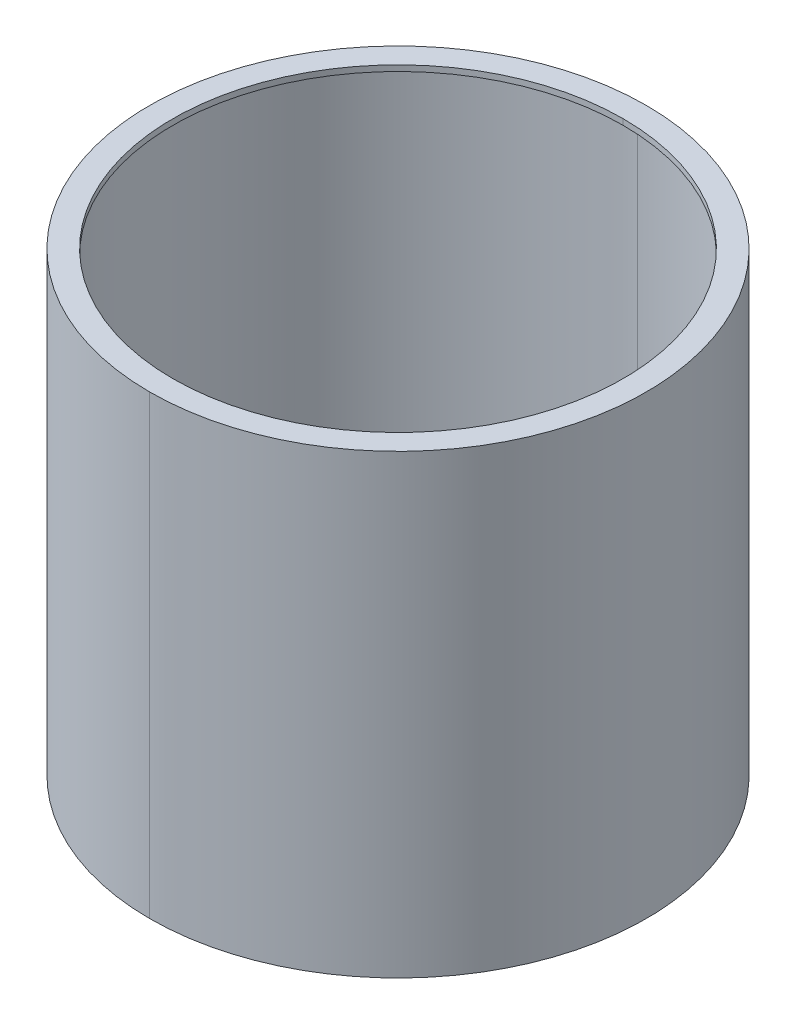
ISO-10303-21;
HEADER;
FILE_DESCRIPTION(('STEP AP214'),'2;1');
FILE_NAME('part.step','',(''),(''),'','','');
FILE_SCHEMA(('AUTOMOTIVE_DESIGN { 1 0 10303 214 1 1 1 1 }'));
ENDSEC;
DATA;
#1=APPLICATION_CONTEXT('core data for automotive mechanical design processes');
#2=APPLICATION_PROTOCOL_DEFINITION('international standard','automotive_design',2000,#1);
#3=PRODUCT_CONTEXT('',#1,'mechanical');
#4=PRODUCT('Part','Part','',(#3));
#5=PRODUCT_RELATED_PRODUCT_CATEGORY('part','',(#4));
#6=PRODUCT_DEFINITION_FORMATION('','',#4);
#7=PRODUCT_DEFINITION_CONTEXT('part definition',#1,'design');
#8=PRODUCT_DEFINITION('design','',#6,#7);
#9=PRODUCT_DEFINITION_SHAPE('','',#8);
#10=(LENGTH_UNIT() NAMED_UNIT(*) SI_UNIT(.MILLI.,.METRE.));
#11=(NAMED_UNIT(*) PLANE_ANGLE_UNIT() SI_UNIT($,.RADIAN.));
#12=(NAMED_UNIT(*) SI_UNIT($,.STERADIAN.) SOLID_ANGLE_UNIT());
#13=UNCERTAINTY_MEASURE_WITH_UNIT(LENGTH_MEASURE(1.E-05),#10,'distance_accuracy_value','');
#14=(GEOMETRIC_REPRESENTATION_CONTEXT(3) GLOBAL_UNCERTAINTY_ASSIGNED_CONTEXT((#13)) GLOBAL_UNIT_ASSIGNED_CONTEXT((#10,
#11,#12)) REPRESENTATION_CONTEXT('',''));
#15=CARTESIAN_POINT('',(0.,0.,0.));
#16=DIRECTION('',(0.,0.,1.));
#17=DIRECTION('',(1.,0.,0.));
#18=AXIS2_PLACEMENT_3D('',#15,#16,#17);
#19=CARTESIAN_POINT('',(0.,19.25,0.));
#20=DIRECTION('',(0.,-1.,0.));
#21=DIRECTION('',(0.,0.,-1.));
#22=AXIS2_PLACEMENT_3D('',#19,#20,#21);
#23=CYLINDRICAL_SURFACE('',#22,20.75);
#24=CARTESIAN_POINT('',(0.,19.25,0.));
#25=DIRECTION('',(0.,-1.,0.));
#26=DIRECTION('',(0.,0.,-1.));
#27=AXIS2_PLACEMENT_3D('',#24,#25,#26);
#28=CIRCLE('',#27,20.75);
#29=CARTESIAN_POINT('',(0.,19.25,20.75));
#30=VERTEX_POINT('',#29);
#31=CARTESIAN_POINT('',(0.,19.25,-20.75));
#32=VERTEX_POINT('',#31);
#33=EDGE_CURVE('E43',#30,#32,#28,.T.);
#34=ORIENTED_EDGE('',*,*,#33,.F.);
#35=DIRECTION('',(0.,-1.,0.));
#36=VECTOR('',#35,1.);
#37=CARTESIAN_POINT('',(0.,19.25,20.75));
#38=LINE('',#37,#36);
#39=CARTESIAN_POINT('',(0.,-19.75,20.75));
#40=VERTEX_POINT('',#39);
#41=EDGE_CURVE('E11',#30,#40,#38,.T.);
#42=ORIENTED_EDGE('',*,*,#41,.T.);
#43=CARTESIAN_POINT('',(0.,-19.75,0.));
#44=DIRECTION('',(0.,-1.,0.));
#45=DIRECTION('',(0.,0.,-1.));
#46=AXIS2_PLACEMENT_3D('',#43,#44,#45);
#47=CIRCLE('',#46,20.75);
#48=CARTESIAN_POINT('',(0.,-19.75,-20.75));
#49=VERTEX_POINT('',#48);
#50=EDGE_CURVE('E29',#40,#49,#47,.T.);
#51=ORIENTED_EDGE('',*,*,#50,.T.);
#52=DIRECTION('',(0.,-1.,0.));
#53=VECTOR('',#52,1.);
#54=CARTESIAN_POINT('',(0.,19.25,-20.75));
#55=LINE('',#54,#53);
#56=EDGE_CURVE('E154',#32,#49,#55,.T.);
#57=ORIENTED_EDGE('',*,*,#56,.F.);
#58=EDGE_LOOP('',(#34,#42,#51,#57));
#59=FACE_BOUND('',#58,.T.);
#60=ADVANCED_FACE('F19',(#59),#23,.F.);
#61=CARTESIAN_POINT('',(0.,19.75,0.));
#62=DIRECTION('',(0.,-1.,0.));
#63=DIRECTION('',(0.,0.,-1.));
#64=AXIS2_PLACEMENT_3D('',#61,#62,#63);
#65=CYLINDRICAL_SURFACE('',#64,21.5);
#66=CARTESIAN_POINT('',(0.,19.75,0.));
#67=DIRECTION('',(0.,1.,0.));
#68=DIRECTION('',(0.,0.,1.));
#69=AXIS2_PLACEMENT_3D('',#66,#67,#68);
#70=CIRCLE('',#69,21.5);
#71=CARTESIAN_POINT('',(0.,19.75,21.5));
#72=VERTEX_POINT('',#71);
#73=CARTESIAN_POINT('',(0.,19.75,-21.5));
#74=VERTEX_POINT('',#73);
#75=EDGE_CURVE('E71',#72,#74,#70,.T.);
#76=ORIENTED_EDGE('',*,*,#75,.F.);
#77=DIRECTION('',(0.,-1.,0.));
#78=VECTOR('',#77,1.);
#79=CARTESIAN_POINT('',(0.,19.75,21.5));
#80=LINE('',#79,#78);
#81=CARTESIAN_POINT('',(0.,-19.75,21.5));
#82=VERTEX_POINT('',#81);
#83=EDGE_CURVE('E141',#72,#82,#80,.T.);
#84=ORIENTED_EDGE('',*,*,#83,.T.);
#85=CARTESIAN_POINT('',(0.,-19.75,0.));
#86=DIRECTION('',(0.,1.,0.));
#87=DIRECTION('',(0.,0.,1.));
#88=AXIS2_PLACEMENT_3D('',#85,#86,#87);
#89=CIRCLE('',#88,21.5);
#90=CARTESIAN_POINT('',(0.,-19.75,-21.5));
#91=VERTEX_POINT('',#90);
#92=EDGE_CURVE('E85',#82,#91,#89,.T.);
#93=ORIENTED_EDGE('',*,*,#92,.T.);
#94=DIRECTION('',(0.,-1.,0.));
#95=VECTOR('',#94,1.);
#96=CARTESIAN_POINT('',(0.,19.75,-21.5));
#97=LINE('',#96,#95);
#98=EDGE_CURVE('E137',#74,#91,#97,.T.);
#99=ORIENTED_EDGE('',*,*,#98,.F.);
#100=EDGE_LOOP('',(#76,#84,#93,#99));
#101=FACE_BOUND('',#100,.T.);
#102=ADVANCED_FACE('F234',(#101),#65,.T.);
#103=CARTESIAN_POINT('',(0.,19.75,0.));
#104=DIRECTION('',(0.,-1.,0.));
#105=DIRECTION('',(0.,0.,-1.));
#106=AXIS2_PLACEMENT_3D('',#103,#104,#105);
#107=CYLINDRICAL_SURFACE('',#106,19.5);
#108=CARTESIAN_POINT('',(0.,19.75,0.));
#109=DIRECTION('',(0.,1.,0.));
#110=DIRECTION('',(0.,0.,1.));
#111=AXIS2_PLACEMENT_3D('',#108,#109,#110);
#112=CIRCLE('',#111,19.5);
#113=CARTESIAN_POINT('',(0.,19.75,-19.5));
#114=VERTEX_POINT('',#113);
#115=CARTESIAN_POINT('',(0.,19.75,19.5));
#116=VERTEX_POINT('',#115);
#117=EDGE_CURVE('E142',#114,#116,#112,.T.);
#118=ORIENTED_EDGE('',*,*,#117,.T.);
#119=DIRECTION('',(0.,-1.,0.));
#120=VECTOR('',#119,1.);
#121=CARTESIAN_POINT('',(0.,19.75,19.5));
#122=LINE('',#121,#120);
#123=CARTESIAN_POINT('',(0.,19.25,19.5));
#124=VERTEX_POINT('',#123);
#125=EDGE_CURVE('E115',#116,#124,#122,.T.);
#126=ORIENTED_EDGE('',*,*,#125,.T.);
#127=CARTESIAN_POINT('',(0.,19.25,0.));
#128=DIRECTION('',(0.,-1.,0.));
#129=DIRECTION('',(0.,0.,-1.));
#130=AXIS2_PLACEMENT_3D('',#127,#128,#129);
#131=CIRCLE('',#130,19.5);
#132=CARTESIAN_POINT('',(0.,19.25,-19.5));
#133=VERTEX_POINT('',#132);
#134=EDGE_CURVE('E113',#124,#133,#131,.T.);
#135=ORIENTED_EDGE('',*,*,#134,.T.);
#136=DIRECTION('',(0.,-1.,0.));
#137=VECTOR('',#136,1.);
#138=CARTESIAN_POINT('',(0.,19.75,-19.5));
#139=LINE('',#138,#137);
#140=EDGE_CURVE('E100',#114,#133,#139,.T.);
#141=ORIENTED_EDGE('',*,*,#140,.F.);
#142=EDGE_LOOP('',(#118,#126,#135,#141));
#143=FACE_BOUND('',#142,.T.);
#144=ADVANCED_FACE('F114',(#143),#107,.F.);
#145=CARTESIAN_POINT('',(0.,19.75,0.));
#146=DIRECTION('',(0.,-1.,0.));
#147=DIRECTION('',(0.,0.,-1.));
#148=AXIS2_PLACEMENT_3D('',#145,#146,#147);
#149=CYLINDRICAL_SURFACE('',#148,19.5);
#150=ORIENTED_EDGE('',*,*,#125,.F.);
#151=CARTESIAN_POINT('',(0.,19.75,0.));
#152=DIRECTION('',(0.,1.,0.));
#153=DIRECTION('',(0.,0.,1.));
#154=AXIS2_PLACEMENT_3D('',#151,#152,#153);
#155=CIRCLE('',#154,19.5);
#156=EDGE_CURVE('E106',#116,#114,#155,.T.);
#157=ORIENTED_EDGE('',*,*,#156,.T.);
#158=ORIENTED_EDGE('',*,*,#140,.T.);
#159=CARTESIAN_POINT('',(0.,19.25,0.));
#160=DIRECTION('',(0.,-1.,0.));
#161=DIRECTION('',(0.,0.,-1.));
#162=AXIS2_PLACEMENT_3D('',#159,#160,#161);
#163=CIRCLE('',#162,19.5);
#164=EDGE_CURVE('E104',#133,#124,#163,.T.);
#165=ORIENTED_EDGE('',*,*,#164,.T.);
#166=EDGE_LOOP('',(#150,#157,#158,#165));
#167=FACE_BOUND('',#166,.T.);
#168=ADVANCED_FACE('F102',(#167),#149,.F.);
#169=CARTESIAN_POINT('',(0.,19.75,0.));
#170=DIRECTION('',(0.,1.,0.));
#171=DIRECTION('',(1.,0.,0.));
#172=AXIS2_PLACEMENT_3D('',#169,#170,#171);
#173=PLANE('',#172);
#174=CARTESIAN_POINT('',(0.,19.75,0.));
#175=DIRECTION('',(0.,1.,0.));
#176=DIRECTION('',(0.,0.,1.));
#177=AXIS2_PLACEMENT_3D('',#174,#175,#176);
#178=CIRCLE('',#177,21.5);
#179=EDGE_CURVE('E121',#74,#72,#178,.T.);
#180=ORIENTED_EDGE('',*,*,#179,.T.);
#181=ORIENTED_EDGE('',*,*,#75,.T.);
#182=EDGE_LOOP('',(#180,#181));
#183=FACE_BOUND('',#182,.T.);
#184=ORIENTED_EDGE('',*,*,#117,.F.);
#185=ORIENTED_EDGE('',*,*,#156,.F.);
#186=EDGE_LOOP('',(#184,#185));
#187=FACE_BOUND('',#186,.T.);
#188=ADVANCED_FACE('F213',(#183,#187),#173,.T.);
#189=CARTESIAN_POINT('',(0.,-19.75,0.));
#190=DIRECTION('',(0.,1.,0.));
#191=DIRECTION('',(1.,0.,0.));
#192=AXIS2_PLACEMENT_3D('',#189,#190,#191);
#193=PLANE('',#192);
#194=CARTESIAN_POINT('',(0.,-19.75,0.));
#195=DIRECTION('',(0.,1.,0.));
#196=DIRECTION('',(0.,0.,1.));
#197=AXIS2_PLACEMENT_3D('',#194,#195,#196);
#198=CIRCLE('',#197,21.5);
#199=EDGE_CURVE('E22',#91,#82,#198,.T.);
#200=ORIENTED_EDGE('',*,*,#199,.F.);
#201=ORIENTED_EDGE('',*,*,#92,.F.);
#202=EDGE_LOOP('',(#200,#201));
#203=FACE_BOUND('',#202,.T.);
#204=CARTESIAN_POINT('',(0.,-19.75,0.));
#205=DIRECTION('',(0.,-1.,0.));
#206=DIRECTION('',(0.,0.,-1.));
#207=AXIS2_PLACEMENT_3D('',#204,#205,#206);
#208=CIRCLE('',#207,20.75);
#209=EDGE_CURVE('E147',#49,#40,#208,.T.);
#210=ORIENTED_EDGE('',*,*,#209,.F.);
#211=ORIENTED_EDGE('',*,*,#50,.F.);
#212=EDGE_LOOP('',(#210,#211));
#213=FACE_BOUND('',#212,.T.);
#214=ADVANCED_FACE('F217',(#203,#213),#193,.F.);
#215=CARTESIAN_POINT('',(0.,19.75,0.));
#216=DIRECTION('',(0.,-1.,0.));
#217=DIRECTION('',(0.,0.,-1.));
#218=AXIS2_PLACEMENT_3D('',#215,#216,#217);
#219=CYLINDRICAL_SURFACE('',#218,21.5);
#220=ORIENTED_EDGE('',*,*,#83,.F.);
#221=ORIENTED_EDGE('',*,*,#179,.F.);
#222=ORIENTED_EDGE('',*,*,#98,.T.);
#223=ORIENTED_EDGE('',*,*,#199,.T.);
#224=EDGE_LOOP('',(#220,#221,#222,#223));
#225=FACE_BOUND('',#224,.T.);
#226=ADVANCED_FACE('F226',(#225),#219,.T.);
#227=CARTESIAN_POINT('',(0.,19.25,0.));
#228=DIRECTION('',(0.,-1.,0.));
#229=DIRECTION('',(0.,0.,-1.));
#230=AXIS2_PLACEMENT_3D('',#227,#228,#229);
#231=CYLINDRICAL_SURFACE('',#230,20.75);
#232=ORIENTED_EDGE('',*,*,#41,.F.);
#233=CARTESIAN_POINT('',(0.,19.25,0.));
#234=DIRECTION('',(0.,-1.,0.));
#235=DIRECTION('',(0.,0.,-1.));
#236=AXIS2_PLACEMENT_3D('',#233,#234,#235);
#237=CIRCLE('',#236,20.75);
#238=EDGE_CURVE('E134',#32,#30,#237,.T.);
#239=ORIENTED_EDGE('',*,*,#238,.F.);
#240=ORIENTED_EDGE('',*,*,#56,.T.);
#241=ORIENTED_EDGE('',*,*,#209,.T.);
#242=EDGE_LOOP('',(#232,#239,#240,#241));
#243=FACE_BOUND('',#242,.T.);
#244=ADVANCED_FACE('F249',(#243),#231,.F.);
#245=CARTESIAN_POINT('',(0.,19.25,0.));
#246=DIRECTION('',(0.,-1.,0.));
#247=DIRECTION('',(0.,0.,-1.));
#248=AXIS2_PLACEMENT_3D('',#245,#246,#247);
#249=PLANE('',#248);
#250=ORIENTED_EDGE('',*,*,#238,.T.);
#251=ORIENTED_EDGE('',*,*,#33,.T.);
#252=EDGE_LOOP('',(#250,#251));
#253=FACE_BOUND('',#252,.T.);
#254=ORIENTED_EDGE('',*,*,#164,.F.);
#255=ORIENTED_EDGE('',*,*,#134,.F.);
#256=EDGE_LOOP('',(#254,#255));
#257=FACE_BOUND('',#256,.T.);
#258=ADVANCED_FACE('F119',(#253,#257),#249,.T.);
#259=CLOSED_SHELL('',(#60,#102,#144,#168,#188,#214,#226,#244,#258));
#260=MANIFOLD_SOLID_BREP('B1',#259);
#261=ADVANCED_BREP_SHAPE_REPRESENTATION('',(#18,#260),#14);
#262=SHAPE_DEFINITION_REPRESENTATION(#9,#261);
ENDSEC;
END-ISO-10303-21;
